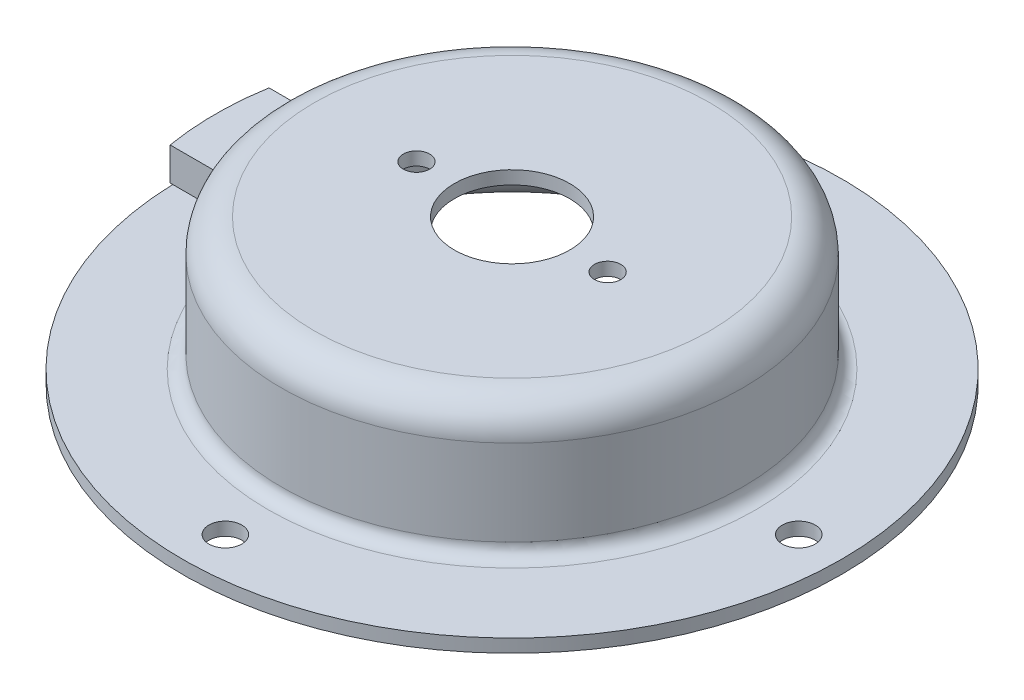
ISO-10303-21;
HEADER;
FILE_DESCRIPTION(('STEP AP214'),'2;1');
FILE_NAME('part.step','',(''),(''),'','','');
FILE_SCHEMA(('AUTOMOTIVE_DESIGN { 1 0 10303 214 1 1 1 1 }'));
ENDSEC;
DATA;
#1=APPLICATION_CONTEXT('core data for automotive mechanical design processes');
#2=APPLICATION_PROTOCOL_DEFINITION('international standard','automotive_design',2000,#1);
#3=PRODUCT_CONTEXT('',#1,'mechanical');
#4=PRODUCT('Part','Part','',(#3));
#5=PRODUCT_RELATED_PRODUCT_CATEGORY('part','',(#4));
#6=PRODUCT_DEFINITION_FORMATION('','',#4);
#7=PRODUCT_DEFINITION_CONTEXT('part definition',#1,'design');
#8=PRODUCT_DEFINITION('design','',#6,#7);
#9=PRODUCT_DEFINITION_SHAPE('','',#8);
#10=(LENGTH_UNIT() NAMED_UNIT(*) SI_UNIT(.MILLI.,.METRE.));
#11=(NAMED_UNIT(*) PLANE_ANGLE_UNIT() SI_UNIT($,.RADIAN.));
#12=(NAMED_UNIT(*) SI_UNIT($,.STERADIAN.) SOLID_ANGLE_UNIT());
#13=UNCERTAINTY_MEASURE_WITH_UNIT(LENGTH_MEASURE(1.E-05),#10,'distance_accuracy_value','');
#14=(GEOMETRIC_REPRESENTATION_CONTEXT(3) GLOBAL_UNCERTAINTY_ASSIGNED_CONTEXT((#13)) GLOBAL_UNIT_ASSIGNED_CONTEXT((#10,
#11,#12)) REPRESENTATION_CONTEXT('',''));
#15=CARTESIAN_POINT('',(0.,0.,0.));
#16=DIRECTION('',(0.,0.,1.));
#17=DIRECTION('',(1.,0.,0.));
#18=AXIS2_PLACEMENT_3D('',#15,#16,#17);
#19=CARTESIAN_POINT('',(-70.001,10.9999999999999,7.5));
#20=DIRECTION('',(0.,1.,0.));
#21=DIRECTION('',(0.,0.,1.));
#22=AXIS2_PLACEMENT_3D('',#19,#20,#21);
#23=PLANE('',#22);
#24=CARTESIAN_POINT('',(0.,10.9999999999999,0.));
#25=DIRECTION('',(0.,1.,0.));
#26=DIRECTION('',(0.,0.,1.));
#27=AXIS2_PLACEMENT_3D('',#24,#25,#26);
#28=CIRCLE('',#27,33.);
#29=CARTESIAN_POINT('',(-32.1364279284429,10.9999999999999,7.5));
#30=VERTEX_POINT('',#29);
#31=CARTESIAN_POINT('',(-32.1364279284428,10.9999999999999,-7.5));
#32=VERTEX_POINT('',#31);
#33=EDGE_CURVE('E134',#30,#32,#28,.F.);
#34=ORIENTED_EDGE('',*,*,#33,.T.);
#35=DIRECTION('',(1.,0.,0.));
#36=VECTOR('',#35,1.);
#37=CARTESIAN_POINT('',(-70.001,10.9999999999999,-7.5));
#38=LINE('',#37,#36);
#39=CARTESIAN_POINT('',(-44.3705983732472,10.9999999999999,-7.5));
#40=VERTEX_POINT('',#39);
#41=EDGE_CURVE('E146',#40,#32,#38,.T.);
#42=ORIENTED_EDGE('',*,*,#41,.F.);
#43=CARTESIAN_POINT('',(0.,10.9999999999999,0.));
#44=DIRECTION('',(0.,1.,0.));
#45=DIRECTION('',(0.,0.,1.));
#46=AXIS2_PLACEMENT_3D('',#43,#44,#45);
#47=CIRCLE('',#46,45.);
#48=CARTESIAN_POINT('',(-44.3705983732472,10.9999999999999,7.5));
#49=VERTEX_POINT('',#48);
#50=EDGE_CURVE('E13',#49,#40,#47,.F.);
#51=ORIENTED_EDGE('',*,*,#50,.F.);
#52=DIRECTION('',(1.,0.,0.));
#53=VECTOR('',#52,1.);
#54=CARTESIAN_POINT('',(-70.001,10.9999999999999,7.5));
#55=LINE('',#54,#53);
#56=EDGE_CURVE('E148',#49,#30,#55,.T.);
#57=ORIENTED_EDGE('',*,*,#56,.T.);
#58=EDGE_LOOP('',(#34,#42,#51,#57));
#59=FACE_BOUND('',#58,.T.);
#60=ADVANCED_FACE('F68',(#59),#23,.T.);
#61=CARTESIAN_POINT('',(-70.001,10.9999999999999,7.5));
#62=DIRECTION('',(0.,0.,1.));
#63=DIRECTION('',(0.,-1.,0.));
#64=AXIS2_PLACEMENT_3D('',#61,#62,#63);
#65=PLANE('',#64);
#66=DIRECTION('',(0.,-1.,0.));
#67=VECTOR('',#66,1.);
#68=CARTESIAN_POINT('',(-32.1364279284429,20.001,7.49999999999989));
#69=LINE('',#68,#67);
#70=CARTESIAN_POINT('',(-32.1364279284429,5.9999999999999,7.49999999999989));
#71=VERTEX_POINT('',#70);
#72=EDGE_CURVE('E140',#30,#71,#69,.T.);
#73=ORIENTED_EDGE('',*,*,#72,.F.);
#74=ORIENTED_EDGE('',*,*,#56,.F.);
#75=DIRECTION('',(0.,-1.,0.));
#76=VECTOR('',#75,1.);
#77=CARTESIAN_POINT('',(-44.3705983732441,-881.361015130249,7.49999999999985));
#78=LINE('',#77,#76);
#79=CARTESIAN_POINT('',(-44.3705983732472,5.99999999999989,7.49999999999985));
#80=VERTEX_POINT('',#79);
#81=EDGE_CURVE('E176',#80,#49,#78,.F.);
#82=ORIENTED_EDGE('',*,*,#81,.F.);
#83=DIRECTION('',(1.,0.,0.));
#84=VECTOR('',#83,1.);
#85=CARTESIAN_POINT('',(-70.001,5.9999999999999,7.5));
#86=LINE('',#85,#84);
#87=EDGE_CURVE('E154',#80,#71,#86,.T.);
#88=ORIENTED_EDGE('',*,*,#87,.T.);
#89=EDGE_LOOP('',(#73,#74,#82,#88));
#90=FACE_BOUND('',#89,.T.);
#91=ADVANCED_FACE('F219',(#90),#65,.T.);
#92=CARTESIAN_POINT('',(-70.001,5.9999999999999,7.5));
#93=DIRECTION('',(0.,-1.,0.));
#94=DIRECTION('',(0.,0.,-1.));
#95=AXIS2_PLACEMENT_3D('',#92,#93,#94);
#96=PLANE('',#95);
#97=CARTESIAN_POINT('',(0.,5.9999999999999,0.));
#98=DIRECTION('',(0.,-1.,0.));
#99=DIRECTION('',(0.,0.,-1.));
#100=AXIS2_PLACEMENT_3D('',#97,#98,#99);
#101=CIRCLE('',#100,33.);
#102=CARTESIAN_POINT('',(-32.1364279284428,5.9999999999999,-7.5));
#103=VERTEX_POINT('',#102);
#104=EDGE_CURVE('E85',#71,#103,#101,.T.);
#105=ORIENTED_EDGE('',*,*,#104,.F.);
#106=ORIENTED_EDGE('',*,*,#87,.F.);
#107=CARTESIAN_POINT('',(0.,5.99999999999989,0.));
#108=DIRECTION('',(0.,-1.,0.));
#109=DIRECTION('',(0.,0.,-1.));
#110=AXIS2_PLACEMENT_3D('',#107,#108,#109);
#111=CIRCLE('',#110,45.);
#112=CARTESIAN_POINT('',(-44.3705983732472,5.99999999999989,-7.5));
#113=VERTEX_POINT('',#112);
#114=EDGE_CURVE('E174',#113,#80,#111,.F.);
#115=ORIENTED_EDGE('',*,*,#114,.F.);
#116=DIRECTION('',(1.,0.,0.));
#117=VECTOR('',#116,1.);
#118=CARTESIAN_POINT('',(-70.001,5.9999999999999,-7.5));
#119=LINE('',#118,#117);
#120=EDGE_CURVE('E162',#113,#103,#119,.T.);
#121=ORIENTED_EDGE('',*,*,#120,.T.);
#122=EDGE_LOOP('',(#105,#106,#115,#121));
#123=FACE_BOUND('',#122,.T.);
#124=ADVANCED_FACE('F216',(#123),#96,.T.);
#125=CARTESIAN_POINT('',(-70.001,10.9999999999999,-7.5));
#126=DIRECTION('',(0.,0.,-1.));
#127=DIRECTION('',(-1.,0.,0.));
#128=AXIS2_PLACEMENT_3D('',#125,#126,#127);
#129=PLANE('',#128);
#130=DIRECTION('',(0.,-1.,0.));
#131=VECTOR('',#130,1.);
#132=CARTESIAN_POINT('',(-32.1364279284428,20.001,-7.5));
#133=LINE('',#132,#131);
#134=EDGE_CURVE('E131',#32,#103,#133,.T.);
#135=ORIENTED_EDGE('',*,*,#134,.T.);
#136=ORIENTED_EDGE('',*,*,#120,.F.);
#137=DIRECTION('',(0.,-1.,0.));
#138=VECTOR('',#137,1.);
#139=CARTESIAN_POINT('',(-44.3705983732441,-881.361015130249,-7.5));
#140=LINE('',#139,#138);
#141=EDGE_CURVE('E152',#40,#113,#140,.T.);
#142=ORIENTED_EDGE('',*,*,#141,.F.);
#143=ORIENTED_EDGE('',*,*,#41,.T.);
#144=EDGE_LOOP('',(#135,#136,#142,#143));
#145=FACE_BOUND('',#144,.T.);
#146=ADVANCED_FACE('F70',(#145),#129,.T.);
#147=CARTESIAN_POINT('',(-70.001,9.9999999999999,7.5));
#148=DIRECTION('',(0.,1.,0.));
#149=DIRECTION('',(0.,0.,1.));
#150=AXIS2_PLACEMENT_3D('',#147,#148,#149);
#151=PLANE('',#150);
#152=DIRECTION('',(1.,0.,0.));
#153=VECTOR('',#152,1.);
#154=CARTESIAN_POINT('',(-70.001,9.9999999999999,-6.5));
#155=LINE('',#154,#153);
#156=CARTESIAN_POINT('',(-44.5280810275943,9.9999999999999,-6.5));
#157=VERTEX_POINT('',#156);
#158=CARTESIAN_POINT('',(-32.3535160376736,9.9999999999999,-6.5));
#159=VERTEX_POINT('',#158);
#160=EDGE_CURVE('E164',#157,#159,#155,.T.);
#161=ORIENTED_EDGE('',*,*,#160,.T.);
#162=CARTESIAN_POINT('',(0.,9.9999999999999,0.));
#163=DIRECTION('',(0.,1.,0.));
#164=DIRECTION('',(0.,0.,1.));
#165=AXIS2_PLACEMENT_3D('',#162,#163,#164);
#166=CIRCLE('',#165,33.);
#167=CARTESIAN_POINT('',(-32.3535160376736,9.9999999999999,6.5));
#168=VERTEX_POINT('',#167);
#169=EDGE_CURVE('E93',#168,#159,#166,.F.);
#170=ORIENTED_EDGE('',*,*,#169,.F.);
#171=DIRECTION('',(1.,0.,0.));
#172=VECTOR('',#171,1.);
#173=CARTESIAN_POINT('',(-70.001,9.9999999999999,6.5));
#174=LINE('',#173,#172);
#175=CARTESIAN_POINT('',(-44.5280810275943,9.9999999999999,6.5));
#176=VERTEX_POINT('',#175);
#177=EDGE_CURVE('E167',#176,#168,#174,.T.);
#178=ORIENTED_EDGE('',*,*,#177,.F.);
#179=CARTESIAN_POINT('',(0.,9.9999999999999,0.));
#180=DIRECTION('',(0.,1.,0.));
#181=DIRECTION('',(0.,0.,1.));
#182=AXIS2_PLACEMENT_3D('',#179,#180,#181);
#183=CIRCLE('',#182,45.);
#184=EDGE_CURVE('E72',#176,#157,#183,.F.);
#185=ORIENTED_EDGE('',*,*,#184,.T.);
#186=EDGE_LOOP('',(#161,#170,#178,#185));
#187=FACE_BOUND('',#186,.T.);
#188=ADVANCED_FACE('F208',(#187),#151,.F.);
#189=CARTESIAN_POINT('',(-70.001,10.9999999999999,6.5));
#190=DIRECTION('',(0.,0.,1.));
#191=DIRECTION('',(0.,-1.,0.));
#192=AXIS2_PLACEMENT_3D('',#189,#190,#191);
#193=PLANE('',#192);
#194=ORIENTED_EDGE('',*,*,#177,.T.);
#195=DIRECTION('',(0.,-1.,0.));
#196=VECTOR('',#195,1.);
#197=CARTESIAN_POINT('',(-32.3535160376736,20.001,6.5));
#198=LINE('',#197,#196);
#199=CARTESIAN_POINT('',(-32.3535160376736,6.9999999999999,6.5));
#200=VERTEX_POINT('',#199);
#201=EDGE_CURVE('E188',#200,#168,#198,.F.);
#202=ORIENTED_EDGE('',*,*,#201,.F.);
#203=DIRECTION('',(1.,0.,0.));
#204=VECTOR('',#203,1.);
#205=CARTESIAN_POINT('',(-70.001,6.9999999999999,6.5));
#206=LINE('',#205,#204);
#207=CARTESIAN_POINT('',(-44.5280810275944,6.9999999999999,6.49999999999985));
#208=VERTEX_POINT('',#207);
#209=EDGE_CURVE('E157',#208,#200,#206,.T.);
#210=ORIENTED_EDGE('',*,*,#209,.F.);
#211=DIRECTION('',(0.,-1.,0.));
#212=VECTOR('',#211,1.);
#213=CARTESIAN_POINT('',(-44.5280810275913,-881.361015130249,6.49999999999985));
#214=LINE('',#213,#212);
#215=EDGE_CURVE('E77',#208,#176,#214,.F.);
#216=ORIENTED_EDGE('',*,*,#215,.T.);
#217=EDGE_LOOP('',(#194,#202,#210,#216));
#218=FACE_BOUND('',#217,.T.);
#219=ADVANCED_FACE('F206',(#218),#193,.F.);
#220=CARTESIAN_POINT('',(-70.001,6.9999999999999,7.5));
#221=DIRECTION('',(0.,-1.,0.));
#222=DIRECTION('',(0.,0.,-1.));
#223=AXIS2_PLACEMENT_3D('',#220,#221,#222);
#224=PLANE('',#223);
#225=ORIENTED_EDGE('',*,*,#209,.T.);
#226=CARTESIAN_POINT('',(0.,6.9999999999999,0.));
#227=DIRECTION('',(0.,-1.,0.));
#228=DIRECTION('',(0.,0.,-1.));
#229=AXIS2_PLACEMENT_3D('',#226,#227,#228);
#230=CIRCLE('',#229,33.);
#231=CARTESIAN_POINT('',(-32.3535160376736,6.9999999999999,-6.5));
#232=VERTEX_POINT('',#231);
#233=EDGE_CURVE('E190',#232,#200,#230,.F.);
#234=ORIENTED_EDGE('',*,*,#233,.F.);
#235=DIRECTION('',(1.,0.,0.));
#236=VECTOR('',#235,1.);
#237=CARTESIAN_POINT('',(-70.001,6.9999999999999,-6.5));
#238=LINE('',#237,#236);
#239=CARTESIAN_POINT('',(-44.5280810275943,6.9999999999999,-6.5));
#240=VERTEX_POINT('',#239);
#241=EDGE_CURVE('E153',#240,#232,#238,.T.);
#242=ORIENTED_EDGE('',*,*,#241,.F.);
#243=CARTESIAN_POINT('',(0.,6.9999999999999,0.));
#244=DIRECTION('',(0.,-1.,0.));
#245=DIRECTION('',(0.,0.,-1.));
#246=AXIS2_PLACEMENT_3D('',#243,#244,#245);
#247=CIRCLE('',#246,45.);
#248=EDGE_CURVE('E180',#240,#208,#247,.F.);
#249=ORIENTED_EDGE('',*,*,#248,.T.);
#250=EDGE_LOOP('',(#225,#234,#242,#249));
#251=FACE_BOUND('',#250,.T.);
#252=ADVANCED_FACE('F198',(#251),#224,.F.);
#253=CARTESIAN_POINT('',(-70.001,10.9999999999999,-6.5));
#254=DIRECTION('',(0.,0.,-1.));
#255=DIRECTION('',(-1.,0.,0.));
#256=AXIS2_PLACEMENT_3D('',#253,#254,#255);
#257=PLANE('',#256);
#258=ORIENTED_EDGE('',*,*,#241,.T.);
#259=DIRECTION('',(0.,-1.,0.));
#260=VECTOR('',#259,1.);
#261=CARTESIAN_POINT('',(-32.3535160376736,20.001,-6.5));
#262=LINE('',#261,#260);
#263=EDGE_CURVE('E149',#159,#232,#262,.T.);
#264=ORIENTED_EDGE('',*,*,#263,.F.);
#265=ORIENTED_EDGE('',*,*,#160,.F.);
#266=DIRECTION('',(0.,-1.,0.));
#267=VECTOR('',#266,1.);
#268=CARTESIAN_POINT('',(-44.5280810275912,-881.361015130249,-6.5));
#269=LINE('',#268,#267);
#270=EDGE_CURVE('E173',#157,#240,#269,.T.);
#271=ORIENTED_EDGE('',*,*,#270,.T.);
#272=EDGE_LOOP('',(#258,#264,#265,#271));
#273=FACE_BOUND('',#272,.T.);
#274=ADVANCED_FACE('F200',(#273),#257,.F.);
#275=CARTESIAN_POINT('',(3.0772555371111E-12,-881.361015130248,0.));
#276=DIRECTION('',(0.,-1.,0.));
#277=DIRECTION('',(1.,0.,0.));
#278=AXIS2_PLACEMENT_3D('',#275,#276,#277);
#279=CYLINDRICAL_SURFACE('',#278,45.);
#280=ORIENTED_EDGE('',*,*,#141,.T.);
#281=ORIENTED_EDGE('',*,*,#114,.T.);
#282=ORIENTED_EDGE('',*,*,#81,.T.);
#283=ORIENTED_EDGE('',*,*,#50,.T.);
#284=EDGE_LOOP('',(#280,#281,#282,#283));
#285=FACE_BOUND('',#284,.T.);
#286=ORIENTED_EDGE('',*,*,#184,.F.);
#287=ORIENTED_EDGE('',*,*,#215,.F.);
#288=ORIENTED_EDGE('',*,*,#248,.F.);
#289=ORIENTED_EDGE('',*,*,#270,.F.);
#290=EDGE_LOOP('',(#286,#287,#288,#289));
#291=FACE_BOUND('',#290,.T.);
#292=ADVANCED_FACE('F203',(#285,#291),#279,.T.);
#293=CARTESIAN_POINT('',(0.,20.001,0.));
#294=DIRECTION('',(0.,-1.,0.));
#295=DIRECTION('',(0.,0.,-1.));
#296=AXIS2_PLACEMENT_3D('',#293,#294,#295);
#297=CYLINDRICAL_SURFACE('',#296,33.);
#298=ORIENTED_EDGE('',*,*,#72,.T.);
#299=ORIENTED_EDGE('',*,*,#104,.T.);
#300=ORIENTED_EDGE('',*,*,#134,.F.);
#301=ORIENTED_EDGE('',*,*,#33,.F.);
#302=EDGE_LOOP('',(#298,#299,#300,#301));
#303=FACE_BOUND('',#302,.T.);
#304=ORIENTED_EDGE('',*,*,#169,.T.);
#305=ORIENTED_EDGE('',*,*,#263,.T.);
#306=ORIENTED_EDGE('',*,*,#233,.T.);
#307=ORIENTED_EDGE('',*,*,#201,.T.);
#308=EDGE_LOOP('',(#304,#305,#306,#307));
#309=FACE_BOUND('',#308,.T.);
#310=ADVANCED_FACE('F133',(#303,#309),#297,.F.);
#311=CLOSED_SHELL('',(#60,#91,#124,#146,#188,#219,#252,#274,#292,#310));
#312=MANIFOLD_SOLID_BREP('B2',#311);
#313=CARTESIAN_POINT('',(37.,-2.00000000000002,0.));
#314=DIRECTION('',(0.,-1.,0.));
#315=DIRECTION('',(1.,0.,0.));
#316=AXIS2_PLACEMENT_3D('',#313,#314,#315);
#317=PLANE('',#316);
#318=CARTESIAN_POINT('',(0.,-2.00000000000022,-43.5));
#319=DIRECTION('',(0.,1.,0.));
#320=DIRECTION('',(-1.,0.,0.));
#321=AXIS2_PLACEMENT_3D('',#318,#319,#320);
#322=CIRCLE('',#321,2.5);
#323=CARTESIAN_POINT('',(-2.49999999999999,-2.00000000000023,-43.5));
#324=VERTEX_POINT('',#323);
#325=EDGE_CURVE('E357',#324,#324,#322,.T.);
#326=ORIENTED_EDGE('',*,*,#325,.T.);
#327=EDGE_LOOP('',(#326));
#328=FACE_BOUND('',#327,.T.);
#329=CARTESIAN_POINT('',(43.5000000000017,-2.00000000000007,-1.69464628172975E-12));
#330=DIRECTION('',(0.,1.,0.));
#331=DIRECTION('',(-1.,0.,0.));
#332=AXIS2_PLACEMENT_3D('',#329,#330,#331);
#333=CIRCLE('',#332,2.50000000000127);
#334=CARTESIAN_POINT('',(41.0000000000004,-2.00000000000008,-1.69464628172975E-12));
#335=VERTEX_POINT('',#334);
#336=EDGE_CURVE('E477',#335,#335,#333,.T.);
#337=ORIENTED_EDGE('',*,*,#336,.T.);
#338=EDGE_LOOP('',(#337));
#339=FACE_BOUND('',#338,.T.);
#340=CARTESIAN_POINT('',(3.39627552613718E-12,-2.00000000000022,43.5));
#341=DIRECTION('',(0.,1.,0.));
#342=DIRECTION('',(-1.,0.,0.));
#343=AXIS2_PLACEMENT_3D('',#340,#341,#342);
#344=CIRCLE('',#343,2.50000000000353);
#345=CARTESIAN_POINT('',(-2.50000000000014,-2.00000000000023,43.5));
#346=VERTEX_POINT('',#345);
#347=EDGE_CURVE('E481',#346,#346,#344,.T.);
#348=ORIENTED_EDGE('',*,*,#347,.T.);
#349=EDGE_LOOP('',(#348));
#350=FACE_BOUND('',#349,.T.);
#351=CARTESIAN_POINT('',(-43.4999999999983,-2.00000000000038,1.69997349530604E-12));
#352=DIRECTION('',(0.,1.,0.));
#353=DIRECTION('',(-1.,0.,0.));
#354=AXIS2_PLACEMENT_3D('',#351,#352,#353);
#355=CIRCLE('',#354,2.50000000000256);
#356=CARTESIAN_POINT('',(-46.0000000000009,-2.00000000000038,1.69997349530604E-12));
#357=VERTEX_POINT('',#356);
#358=EDGE_CURVE('E485',#357,#357,#355,.T.);
#359=ORIENTED_EDGE('',*,*,#358,.T.);
#360=EDGE_LOOP('',(#359));
#361=FACE_BOUND('',#360,.T.);
#362=CARTESIAN_POINT('',(0.,-2.00000000000022,0.));
#363=DIRECTION('',(0.,-1.,0.));
#364=DIRECTION('',(1.,0.,0.));
#365=AXIS2_PLACEMENT_3D('',#362,#363,#364);
#366=CIRCLE('',#365,50.);
#367=CARTESIAN_POINT('',(50.,-2.00000000000005,0.));
#368=VERTEX_POINT('',#367);
#369=EDGE_CURVE('E66',#368,#368,#366,.T.);
#370=ORIENTED_EDGE('',*,*,#369,.T.);
#371=EDGE_LOOP('',(#370));
#372=FACE_BOUND('',#371,.T.);
#373=CARTESIAN_POINT('',(0.,-2.00000000000011,0.));
#374=DIRECTION('',(0.,-1.,0.));
#375=DIRECTION('',(1.,0.,0.));
#376=AXIS2_PLACEMENT_3D('',#373,#374,#375);
#377=CIRCLE('',#376,37.);
#378=CARTESIAN_POINT('',(37.,-1.99999999999998,0.));
#379=VERTEX_POINT('',#378);
#380=EDGE_CURVE('E385',#379,#379,#377,.T.);
#381=ORIENTED_EDGE('',*,*,#380,.F.);
#382=EDGE_LOOP('',(#381));
#383=FACE_BOUND('',#382,.T.);
#384=ADVANCED_FACE('F299',(#328,#339,#350,#361,#372,#383),#317,.T.);
#385=CARTESIAN_POINT('',(3.0772555371111E-12,-881.361015130248,0.));
#386=DIRECTION('',(0.,-1.,0.));
#387=DIRECTION('',(1.,0.,0.));
#388=AXIS2_PLACEMENT_3D('',#385,#386,#387);
#389=CYLINDRICAL_SURFACE('',#388,50.);
#390=ORIENTED_EDGE('',*,*,#369,.F.);
#391=EDGE_LOOP('',(#390));
#392=FACE_BOUND('',#391,.T.);
#393=CARTESIAN_POINT('',(0.,-2.22044604925031E-13,0.));
#394=DIRECTION('',(0.,-1.,0.));
#395=DIRECTION('',(1.,0.,0.));
#396=AXIS2_PLACEMENT_3D('',#393,#394,#395);
#397=CIRCLE('',#396,50.);
#398=CARTESIAN_POINT('',(50.,0.,0.));
#399=VERTEX_POINT('',#398);
#400=EDGE_CURVE('E306',#399,#399,#397,.T.);
#401=ORIENTED_EDGE('',*,*,#400,.T.);
#402=EDGE_LOOP('',(#401));
#403=FACE_BOUND('',#402,.T.);
#404=ADVANCED_FACE('F425',(#392,#403),#389,.T.);
#405=CARTESIAN_POINT('',(37.,0.,0.));
#406=DIRECTION('',(0.,-1.,0.));
#407=DIRECTION('',(1.,0.,0.));
#408=AXIS2_PLACEMENT_3D('',#405,#406,#407);
#409=PLANE('',#408);
#410=CARTESIAN_POINT('',(0.,0.,-43.5));
#411=DIRECTION('',(0.,1.,0.));
#412=DIRECTION('',(-1.,0.,0.));
#413=AXIS2_PLACEMENT_3D('',#410,#411,#412);
#414=CIRCLE('',#413,2.5);
#415=CARTESIAN_POINT('',(-2.5,0.,-43.5));
#416=VERTEX_POINT('',#415);
#417=EDGE_CURVE('E362',#416,#416,#414,.T.);
#418=ORIENTED_EDGE('',*,*,#417,.F.);
#419=EDGE_LOOP('',(#418));
#420=FACE_BOUND('',#419,.T.);
#421=CARTESIAN_POINT('',(43.5000000000017,1.51879438239682E-13,-1.69464628172975E-12));
#422=DIRECTION('',(0.,1.,0.));
#423=DIRECTION('',(-1.,0.,0.));
#424=AXIS2_PLACEMENT_3D('',#421,#422,#423);
#425=CIRCLE('',#424,2.50000000000127);
#426=CARTESIAN_POINT('',(41.0000000000004,1.4315073489257E-13,-1.69464628172975E-12));
#427=VERTEX_POINT('',#426);
#428=EDGE_CURVE('E553',#427,#427,#425,.T.);
#429=ORIENTED_EDGE('',*,*,#428,.F.);
#430=EDGE_LOOP('',(#429));
#431=FACE_BOUND('',#430,.T.);
#432=CARTESIAN_POINT('',(3.3892925634595E-12,0.,43.5));
#433=DIRECTION('',(0.,1.,0.));
#434=DIRECTION('',(-1.,0.,0.));
#435=AXIS2_PLACEMENT_3D('',#432,#433,#434);
#436=CIRCLE('',#435,2.50000000000353);
#437=CARTESIAN_POINT('',(-2.50000000000014,0.,43.5));
#438=VERTEX_POINT('',#437);
#439=EDGE_CURVE('E559',#438,#438,#436,.T.);
#440=ORIENTED_EDGE('',*,*,#439,.F.);
#441=EDGE_LOOP('',(#440));
#442=FACE_BOUND('',#441,.T.);
#443=CARTESIAN_POINT('',(-43.4999999999983,-1.5187943823967E-13,1.69997349530604E-12));
#444=DIRECTION('',(0.,1.,0.));
#445=DIRECTION('',(-1.,0.,0.));
#446=AXIS2_PLACEMENT_3D('',#443,#444,#445);
#447=CIRCLE('',#446,2.50000000000256);
#448=CARTESIAN_POINT('',(-46.0000000000009,-1.60608141586787E-13,1.69997349530604E-12));
#449=VERTEX_POINT('',#448);
#450=EDGE_CURVE('E365',#449,#449,#447,.T.);
#451=ORIENTED_EDGE('',*,*,#450,.F.);
#452=EDGE_LOOP('',(#451));
#453=FACE_BOUND('',#452,.T.);
#454=ORIENTED_EDGE('',*,*,#400,.F.);
#455=EDGE_LOOP('',(#454));
#456=FACE_BOUND('',#455,.T.);
#457=CARTESIAN_POINT('',(0.,-1.11022302462516E-13,0.));
#458=DIRECTION('',(0.,-1.,0.));
#459=DIRECTION('',(1.,0.,0.));
#460=AXIS2_PLACEMENT_3D('',#457,#458,#459);
#461=CIRCLE('',#460,37.);
#462=CARTESIAN_POINT('',(37.,0.,0.));
#463=VERTEX_POINT('',#462);
#464=EDGE_CURVE('E420',#463,#463,#461,.T.);
#465=ORIENTED_EDGE('',*,*,#464,.T.);
#466=EDGE_LOOP('',(#465));
#467=FACE_BOUND('',#466,.T.);
#468=ADVANCED_FACE('F427',(#420,#431,#442,#453,#456,#467),#409,.F.);
#469=CARTESIAN_POINT('',(0.,1.99999999999989,0.));
#470=DIRECTION('',(0.,-1.,0.));
#471=DIRECTION('',(1.,0.,0.));
#472=AXIS2_PLACEMENT_3D('',#469,#470,#471);
#473=TOROIDAL_SURFACE('',#472,37.,2.);
#474=ORIENTED_EDGE('',*,*,#464,.F.);
#475=EDGE_LOOP('',(#474));
#476=FACE_BOUND('',#475,.T.);
#477=CARTESIAN_POINT('',(0.,1.99999999999989,0.));
#478=DIRECTION('',(0.,-1.,0.));
#479=DIRECTION('',(1.,0.,0.));
#480=AXIS2_PLACEMENT_3D('',#477,#478,#479);
#481=CIRCLE('',#480,35.);
#482=CARTESIAN_POINT('',(35.,2.00000000000001,0.));
#483=VERTEX_POINT('',#482);
#484=EDGE_CURVE('E417',#483,#483,#481,.T.);
#485=ORIENTED_EDGE('',*,*,#484,.T.);
#486=EDGE_LOOP('',(#485));
#487=FACE_BOUND('',#486,.T.);
#488=ADVANCED_FACE('F430',(#476,#487),#473,.F.);
#489=CARTESIAN_POINT('',(3.0772555371111E-12,-881.361015130248,0.));
#490=DIRECTION('',(0.,-1.,0.));
#491=DIRECTION('',(1.,0.,0.));
#492=AXIS2_PLACEMENT_3D('',#489,#490,#491);
#493=CYLINDRICAL_SURFACE('',#492,35.);
#494=CARTESIAN_POINT('',(0.,5.99999999999989,0.));
#495=DIRECTION('',(0.,-1.,0.));
#496=DIRECTION('',(0.,0.,-1.));
#497=AXIS2_PLACEMENT_3D('',#494,#495,#496);
#498=CIRCLE('',#497,35.);
#499=CARTESIAN_POINT('',(-34.1869858279434,5.99999999999989,-7.5));
#500=VERTEX_POINT('',#499);
#501=CARTESIAN_POINT('',(-34.1869858279435,5.9999999999999,7.5));
#502=VERTEX_POINT('',#501);
#503=EDGE_CURVE('E370',#500,#502,#498,.F.);
#504=ORIENTED_EDGE('',*,*,#503,.F.);
#505=DIRECTION('',(0.,-1.,0.));
#506=VECTOR('',#505,1.);
#507=CARTESIAN_POINT('',(-34.1869858279403,-881.361015130249,-7.5));
#508=LINE('',#507,#506);
#509=CARTESIAN_POINT('',(-34.1869858279434,10.9999999999999,-7.5));
#510=VERTEX_POINT('',#509);
#511=EDGE_CURVE('E373',#510,#500,#508,.T.);
#512=ORIENTED_EDGE('',*,*,#511,.F.);
#513=CARTESIAN_POINT('',(0.,10.9999999999999,0.));
#514=DIRECTION('',(0.,1.,0.));
#515=DIRECTION('',(0.,0.,1.));
#516=AXIS2_PLACEMENT_3D('',#513,#514,#515);
#517=CIRCLE('',#516,35.);
#518=CARTESIAN_POINT('',(-34.1869858279434,10.9999999999999,7.5));
#519=VERTEX_POINT('',#518);
#520=EDGE_CURVE('E345',#519,#510,#517,.F.);
#521=ORIENTED_EDGE('',*,*,#520,.F.);
#522=DIRECTION('',(0.,-1.,0.));
#523=VECTOR('',#522,1.);
#524=CARTESIAN_POINT('',(-34.1869858279404,-881.361015130249,7.49999999999985));
#525=LINE('',#524,#523);
#526=EDGE_CURVE('E313',#502,#519,#525,.F.);
#527=ORIENTED_EDGE('',*,*,#526,.F.);
#528=EDGE_LOOP('',(#504,#512,#521,#527));
#529=FACE_BOUND('',#528,.T.);
#530=ORIENTED_EDGE('',*,*,#484,.F.);
#531=EDGE_LOOP('',(#530));
#532=FACE_BOUND('',#531,.T.);
#533=CARTESIAN_POINT('',(0.,14.9999999999999,0.));
#534=DIRECTION('',(0.,-1.,0.));
#535=DIRECTION('',(1.,0.,0.));
#536=AXIS2_PLACEMENT_3D('',#533,#534,#535);
#537=CIRCLE('',#536,35.0000000000001);
#538=CARTESIAN_POINT('',(35.,15.,0.));
#539=VERTEX_POINT('',#538);
#540=EDGE_CURVE('E414',#539,#539,#537,.T.);
#541=ORIENTED_EDGE('',*,*,#540,.T.);
#542=EDGE_LOOP('',(#541));
#543=FACE_BOUND('',#542,.T.);
#544=ADVANCED_FACE('F437',(#529,#532,#543),#493,.T.);
#545=CARTESIAN_POINT('',(0.,14.9999999999999,0.));
#546=DIRECTION('',(0.,-1.,0.));
#547=DIRECTION('',(1.,0.,0.));
#548=AXIS2_PLACEMENT_3D('',#545,#546,#547);
#549=TOROIDAL_SURFACE('',#548,30.0000000000001,5.00000000000001);
#550=ORIENTED_EDGE('',*,*,#540,.F.);
#551=EDGE_LOOP('',(#550));
#552=FACE_BOUND('',#551,.T.);
#553=CARTESIAN_POINT('',(0.,19.9999999999999,0.));
#554=DIRECTION('',(0.,-1.,0.));
#555=DIRECTION('',(1.,0.,0.));
#556=AXIS2_PLACEMENT_3D('',#553,#554,#555);
#557=CIRCLE('',#556,30.0000000000001);
#558=CARTESIAN_POINT('',(30.,20.,0.));
#559=VERTEX_POINT('',#558);
#560=EDGE_CURVE('E411',#559,#559,#557,.T.);
#561=ORIENTED_EDGE('',*,*,#560,.T.);
#562=EDGE_LOOP('',(#561));
#563=FACE_BOUND('',#562,.T.);
#564=ADVANCED_FACE('F443',(#552,#563),#549,.T.);
#565=CARTESIAN_POINT('',(0.,20.,0.));
#566=DIRECTION('',(0.,-1.,0.));
#567=DIRECTION('',(1.,0.,0.));
#568=AXIS2_PLACEMENT_3D('',#565,#566,#567);
#569=PLANE('',#568);
#570=CARTESIAN_POINT('',(14.4999999999999,20.,0.));
#571=DIRECTION('',(0.,1.,0.));
#572=DIRECTION('',(-1.,0.,0.));
#573=AXIS2_PLACEMENT_3D('',#570,#571,#572);
#574=CIRCLE('',#573,2.);
#575=CARTESIAN_POINT('',(12.4999999999999,20.,0.));
#576=VERTEX_POINT('',#575);
#577=EDGE_CURVE('E382',#576,#576,#574,.T.);
#578=ORIENTED_EDGE('',*,*,#577,.F.);
#579=EDGE_LOOP('',(#578));
#580=FACE_BOUND('',#579,.T.);
#581=CARTESIAN_POINT('',(-14.5000000000001,19.9999999999999,0.));
#582=DIRECTION('',(0.,1.,0.));
#583=DIRECTION('',(-1.,0.,0.));
#584=AXIS2_PLACEMENT_3D('',#581,#582,#583);
#585=CIRCLE('',#584,2.);
#586=CARTESIAN_POINT('',(-16.5000000000001,19.9999999999999,0.));
#587=VERTEX_POINT('',#586);
#588=EDGE_CURVE('E389',#587,#587,#585,.T.);
#589=ORIENTED_EDGE('',*,*,#588,.F.);
#590=EDGE_LOOP('',(#589));
#591=FACE_BOUND('',#590,.T.);
#592=CARTESIAN_POINT('',(0.,20.,0.));
#593=DIRECTION('',(0.,1.,0.));
#594=DIRECTION('',(-1.,0.,0.));
#595=AXIS2_PLACEMENT_3D('',#592,#593,#594);
#596=CIRCLE('',#595,8.75);
#597=CARTESIAN_POINT('',(-8.75000000000007,19.9999999999999,0.));
#598=VERTEX_POINT('',#597);
#599=EDGE_CURVE('E395',#598,#598,#596,.T.);
#600=ORIENTED_EDGE('',*,*,#599,.F.);
#601=EDGE_LOOP('',(#600));
#602=FACE_BOUND('',#601,.T.);
#603=ORIENTED_EDGE('',*,*,#560,.F.);
#604=EDGE_LOOP('',(#603));
#605=FACE_BOUND('',#604,.T.);
#606=ADVANCED_FACE('F450',(#580,#591,#602,#605),#569,.F.);
#607=CARTESIAN_POINT('',(0.,18.,0.));
#608=DIRECTION('',(0.,-1.,0.));
#609=DIRECTION('',(1.,0.,0.));
#610=AXIS2_PLACEMENT_3D('',#607,#608,#609);
#611=PLANE('',#610);
#612=CARTESIAN_POINT('',(14.4999999999999,18.,0.));
#613=DIRECTION('',(0.,-1.,0.));
#614=DIRECTION('',(1.,0.,0.));
#615=AXIS2_PLACEMENT_3D('',#612,#613,#614);
#616=CIRCLE('',#615,2.);
#617=CARTESIAN_POINT('',(16.4999999999999,18.,0.));
#618=VERTEX_POINT('',#617);
#619=EDGE_CURVE('E386',#618,#618,#616,.F.);
#620=ORIENTED_EDGE('',*,*,#619,.T.);
#621=EDGE_LOOP('',(#620));
#622=FACE_BOUND('',#621,.T.);
#623=CARTESIAN_POINT('',(-14.5000000000001,17.9999999999999,0.));
#624=DIRECTION('',(0.,-1.,0.));
#625=DIRECTION('',(1.,0.,0.));
#626=AXIS2_PLACEMENT_3D('',#623,#624,#625);
#627=CIRCLE('',#626,2.);
#628=CARTESIAN_POINT('',(-12.5000000000001,17.9999999999999,0.));
#629=VERTEX_POINT('',#628);
#630=EDGE_CURVE('E392',#629,#629,#627,.F.);
#631=ORIENTED_EDGE('',*,*,#630,.T.);
#632=EDGE_LOOP('',(#631));
#633=FACE_BOUND('',#632,.T.);
#634=CARTESIAN_POINT('',(0.,18.,0.));
#635=DIRECTION('',(0.,-1.,0.));
#636=DIRECTION('',(1.,0.,0.));
#637=AXIS2_PLACEMENT_3D('',#634,#635,#636);
#638=CIRCLE('',#637,8.75);
#639=CARTESIAN_POINT('',(8.74999999999994,18.,0.));
#640=VERTEX_POINT('',#639);
#641=EDGE_CURVE('E381',#640,#640,#638,.F.);
#642=ORIENTED_EDGE('',*,*,#641,.T.);
#643=EDGE_LOOP('',(#642));
#644=FACE_BOUND('',#643,.T.);
#645=CARTESIAN_POINT('',(0.,17.9999999999999,0.));
#646=DIRECTION('',(0.,-1.,0.));
#647=DIRECTION('',(1.,0.,0.));
#648=AXIS2_PLACEMENT_3D('',#645,#646,#647);
#649=CIRCLE('',#648,30.0000000000001);
#650=CARTESIAN_POINT('',(30.,18.,0.));
#651=VERTEX_POINT('',#650);
#652=EDGE_CURVE('E408',#651,#651,#649,.T.);
#653=ORIENTED_EDGE('',*,*,#652,.T.);
#654=EDGE_LOOP('',(#653));
#655=FACE_BOUND('',#654,.T.);
#656=ADVANCED_FACE('F455',(#622,#633,#644,#655),#611,.T.);
#657=CARTESIAN_POINT('',(0.,14.9999999999999,0.));
#658=DIRECTION('',(0.,-1.,0.));
#659=DIRECTION('',(1.,0.,0.));
#660=AXIS2_PLACEMENT_3D('',#657,#658,#659);
#661=TOROIDAL_SURFACE('',#660,30.0000000000001,3.00000000000001);
#662=CARTESIAN_POINT('',(0.,14.9999999999999,0.));
#663=DIRECTION('',(0.,-1.,0.));
#664=DIRECTION('',(1.,0.,0.));
#665=AXIS2_PLACEMENT_3D('',#662,#663,#664);
#666=CIRCLE('',#665,33.0000000000001);
#667=CARTESIAN_POINT('',(33.,15.,0.));
#668=VERTEX_POINT('',#667);
#669=EDGE_CURVE('E405',#668,#668,#666,.T.);
#670=ORIENTED_EDGE('',*,*,#669,.T.);
#671=EDGE_LOOP('',(#670));
#672=FACE_BOUND('',#671,.T.);
#673=ORIENTED_EDGE('',*,*,#652,.F.);
#674=EDGE_LOOP('',(#673));
#675=FACE_BOUND('',#674,.T.);
#676=ADVANCED_FACE('F461',(#672,#675),#661,.F.);
#677=CARTESIAN_POINT('',(3.0772555371111E-12,-881.361015130248,0.));
#678=DIRECTION('',(0.,-1.,0.));
#679=DIRECTION('',(1.,0.,0.));
#680=AXIS2_PLACEMENT_3D('',#677,#678,#679);
#681=CYLINDRICAL_SURFACE('',#680,33.);
#682=DIRECTION('',(0.,-1.,0.));
#683=VECTOR('',#682,1.);
#684=CARTESIAN_POINT('',(-32.1364279284398,-881.361015130249,-7.5));
#685=LINE('',#684,#683);
#686=CARTESIAN_POINT('',(-32.1364279284429,10.9999999999999,-7.5));
#687=VERTEX_POINT('',#686);
#688=CARTESIAN_POINT('',(-32.1364279284429,5.99999999999989,-7.5));
#689=VERTEX_POINT('',#688);
#690=EDGE_CURVE('E359',#687,#689,#685,.T.);
#691=ORIENTED_EDGE('',*,*,#690,.T.);
#692=CARTESIAN_POINT('',(0.,5.99999999999989,0.));
#693=DIRECTION('',(0.,-1.,0.));
#694=DIRECTION('',(0.,0.,-1.));
#695=AXIS2_PLACEMENT_3D('',#692,#693,#694);
#696=CIRCLE('',#695,33.);
#697=CARTESIAN_POINT('',(-32.1364279284429,5.99999999999989,7.49999999999985));
#698=VERTEX_POINT('',#697);
#699=EDGE_CURVE('E356',#689,#698,#696,.F.);
#700=ORIENTED_EDGE('',*,*,#699,.T.);
#701=DIRECTION('',(0.,-1.,0.));
#702=VECTOR('',#701,1.);
#703=CARTESIAN_POINT('',(-32.1364279284398,-881.361015130249,7.49999999999985));
#704=LINE('',#703,#702);
#705=CARTESIAN_POINT('',(-32.1364279284429,10.9999999999999,7.5));
#706=VERTEX_POINT('',#705);
#707=EDGE_CURVE('E349',#698,#706,#704,.F.);
#708=ORIENTED_EDGE('',*,*,#707,.T.);
#709=CARTESIAN_POINT('',(0.,10.9999999999999,0.));
#710=DIRECTION('',(0.,1.,0.));
#711=DIRECTION('',(0.,0.,1.));
#712=AXIS2_PLACEMENT_3D('',#709,#710,#711);
#713=CIRCLE('',#712,33.);
#714=EDGE_CURVE('E338',#706,#687,#713,.F.);
#715=ORIENTED_EDGE('',*,*,#714,.T.);
#716=EDGE_LOOP('',(#691,#700,#708,#715));
#717=FACE_BOUND('',#716,.T.);
#718=CARTESIAN_POINT('',(0.,1.99999999999989,0.));
#719=DIRECTION('',(0.,-1.,0.));
#720=DIRECTION('',(1.,0.,0.));
#721=AXIS2_PLACEMENT_3D('',#718,#719,#720);
#722=CIRCLE('',#721,33.);
#723=CARTESIAN_POINT('',(33.,2.00000000000001,0.));
#724=VERTEX_POINT('',#723);
#725=EDGE_CURVE('E402',#724,#724,#722,.T.);
#726=ORIENTED_EDGE('',*,*,#725,.T.);
#727=EDGE_LOOP('',(#726));
#728=FACE_BOUND('',#727,.T.);
#729=ORIENTED_EDGE('',*,*,#669,.F.);
#730=EDGE_LOOP('',(#729));
#731=FACE_BOUND('',#730,.T.);
#732=ADVANCED_FACE('F354',(#717,#728,#731),#681,.F.);
#733=CARTESIAN_POINT('',(0.,1.99999999999989,0.));
#734=DIRECTION('',(0.,-1.,0.));
#735=DIRECTION('',(1.,0.,0.));
#736=AXIS2_PLACEMENT_3D('',#733,#734,#735);
#737=TOROIDAL_SURFACE('',#736,37.,4.);
#738=ORIENTED_EDGE('',*,*,#380,.T.);
#739=EDGE_LOOP('',(#738));
#740=FACE_BOUND('',#739,.T.);
#741=ORIENTED_EDGE('',*,*,#725,.F.);
#742=EDGE_LOOP('',(#741));
#743=FACE_BOUND('',#742,.T.);
#744=ADVANCED_FACE('F490',(#740,#743),#737,.T.);
#745=CARTESIAN_POINT('',(0.,-2.00100000000023,0.));
#746=DIRECTION('',(0.,1.,0.));
#747=DIRECTION('',(-1.,0.,0.));
#748=AXIS2_PLACEMENT_3D('',#745,#746,#747);
#749=CYLINDRICAL_SURFACE('',#748,8.75);
#750=ORIENTED_EDGE('',*,*,#641,.F.);
#751=EDGE_LOOP('',(#750));
#752=FACE_BOUND('',#751,.T.);
#753=ORIENTED_EDGE('',*,*,#599,.T.);
#754=EDGE_LOOP('',(#753));
#755=FACE_BOUND('',#754,.T.);
#756=ADVANCED_FACE('F493',(#752,#755),#749,.F.);
#757=CARTESIAN_POINT('',(-14.5,-2.00100000000028,0.));
#758=DIRECTION('',(0.,1.,0.));
#759=DIRECTION('',(-1.,0.,0.));
#760=AXIS2_PLACEMENT_3D('',#757,#758,#759);
#761=CYLINDRICAL_SURFACE('',#760,2.);
#762=ORIENTED_EDGE('',*,*,#630,.F.);
#763=EDGE_LOOP('',(#762));
#764=FACE_BOUND('',#763,.T.);
#765=ORIENTED_EDGE('',*,*,#588,.T.);
#766=EDGE_LOOP('',(#765));
#767=FACE_BOUND('',#766,.T.);
#768=ADVANCED_FACE('F511',(#764,#767),#761,.F.);
#769=CARTESIAN_POINT('',(14.5,-2.00100000000017,0.));
#770=DIRECTION('',(0.,1.,0.));
#771=DIRECTION('',(-1.,0.,0.));
#772=AXIS2_PLACEMENT_3D('',#769,#770,#771);
#773=CYLINDRICAL_SURFACE('',#772,2.);
#774=ORIENTED_EDGE('',*,*,#619,.F.);
#775=EDGE_LOOP('',(#774));
#776=FACE_BOUND('',#775,.T.);
#777=ORIENTED_EDGE('',*,*,#577,.T.);
#778=EDGE_LOOP('',(#777));
#779=FACE_BOUND('',#778,.T.);
#780=ADVANCED_FACE('F515',(#776,#779),#773,.F.);
#781=CARTESIAN_POINT('',(-50.001,10.9999999999999,-7.5));
#782=DIRECTION('',(0.,0.,-1.));
#783=DIRECTION('',(-1.,0.,0.));
#784=AXIS2_PLACEMENT_3D('',#781,#782,#783);
#785=PLANE('',#784);
#786=ORIENTED_EDGE('',*,*,#511,.T.);
#787=DIRECTION('',(1.,0.,0.));
#788=VECTOR('',#787,1.);
#789=CARTESIAN_POINT('',(-50.001,5.9999999999999,-7.5));
#790=LINE('',#789,#788);
#791=EDGE_CURVE('E346',#500,#689,#790,.T.);
#792=ORIENTED_EDGE('',*,*,#791,.T.);
#793=ORIENTED_EDGE('',*,*,#690,.F.);
#794=DIRECTION('',(1.,0.,0.));
#795=VECTOR('',#794,1.);
#796=CARTESIAN_POINT('',(-50.001,10.9999999999999,-7.5));
#797=LINE('',#796,#795);
#798=EDGE_CURVE('E321',#510,#687,#797,.T.);
#799=ORIENTED_EDGE('',*,*,#798,.F.);
#800=EDGE_LOOP('',(#786,#792,#793,#799));
#801=FACE_BOUND('',#800,.T.);
#802=ADVANCED_FACE('F519',(#801),#785,.F.);
#803=CARTESIAN_POINT('',(-50.001,5.9999999999999,7.5));
#804=DIRECTION('',(0.,-1.,0.));
#805=DIRECTION('',(0.,0.,-1.));
#806=AXIS2_PLACEMENT_3D('',#803,#804,#805);
#807=PLANE('',#806);
#808=ORIENTED_EDGE('',*,*,#503,.T.);
#809=DIRECTION('',(1.,0.,0.));
#810=VECTOR('',#809,1.);
#811=CARTESIAN_POINT('',(-50.001,5.9999999999999,7.5));
#812=LINE('',#811,#810);
#813=EDGE_CURVE('E351',#502,#698,#812,.T.);
#814=ORIENTED_EDGE('',*,*,#813,.T.);
#815=ORIENTED_EDGE('',*,*,#699,.F.);
#816=ORIENTED_EDGE('',*,*,#791,.F.);
#817=EDGE_LOOP('',(#808,#814,#815,#816));
#818=FACE_BOUND('',#817,.T.);
#819=ADVANCED_FACE('F523',(#818),#807,.F.);
#820=CARTESIAN_POINT('',(-50.001,10.9999999999999,7.5));
#821=DIRECTION('',(0.,0.,1.));
#822=DIRECTION('',(0.,-1.,0.));
#823=AXIS2_PLACEMENT_3D('',#820,#821,#822);
#824=PLANE('',#823);
#825=ORIENTED_EDGE('',*,*,#526,.T.);
#826=DIRECTION('',(1.,0.,0.));
#827=VECTOR('',#826,1.);
#828=CARTESIAN_POINT('',(-50.001,10.9999999999999,7.5));
#829=LINE('',#828,#827);
#830=EDGE_CURVE('E340',#519,#706,#829,.T.);
#831=ORIENTED_EDGE('',*,*,#830,.T.);
#832=ORIENTED_EDGE('',*,*,#707,.F.);
#833=ORIENTED_EDGE('',*,*,#813,.F.);
#834=EDGE_LOOP('',(#825,#831,#832,#833));
#835=FACE_BOUND('',#834,.T.);
#836=ADVANCED_FACE('F348',(#835),#824,.F.);
#837=CARTESIAN_POINT('',(-50.001,10.9999999999999,7.5));
#838=DIRECTION('',(0.,1.,0.));
#839=DIRECTION('',(0.,0.,1.));
#840=AXIS2_PLACEMENT_3D('',#837,#838,#839);
#841=PLANE('',#840);
#842=ORIENTED_EDGE('',*,*,#520,.T.);
#843=ORIENTED_EDGE('',*,*,#798,.T.);
#844=ORIENTED_EDGE('',*,*,#714,.F.);
#845=ORIENTED_EDGE('',*,*,#830,.F.);
#846=EDGE_LOOP('',(#842,#843,#844,#845));
#847=FACE_BOUND('',#846,.T.);
#848=ADVANCED_FACE('F339',(#847),#841,.F.);
#849=CARTESIAN_POINT('',(-43.4999999999983,-2.00000000000038,1.69997349530604E-12));
#850=DIRECTION('',(0.,1.,0.));
#851=DIRECTION('',(-1.,0.,0.));
#852=AXIS2_PLACEMENT_3D('',#849,#850,#851);
#853=CYLINDRICAL_SURFACE('',#852,2.50000000000256);
#854=ORIENTED_EDGE('',*,*,#358,.F.);
#855=EDGE_LOOP('',(#854));
#856=FACE_BOUND('',#855,.T.);
#857=ORIENTED_EDGE('',*,*,#450,.T.);
#858=EDGE_LOOP('',(#857));
#859=FACE_BOUND('',#858,.T.);
#860=ADVANCED_FACE('F527',(#856,#859),#853,.F.);
#861=CARTESIAN_POINT('',(3.39627552613718E-12,-2.00000000000022,43.5));
#862=DIRECTION('',(0.,1.,0.));
#863=DIRECTION('',(-1.,0.,0.));
#864=AXIS2_PLACEMENT_3D('',#861,#862,#863);
#865=CYLINDRICAL_SURFACE('',#864,2.50000000000353);
#866=ORIENTED_EDGE('',*,*,#347,.F.);
#867=EDGE_LOOP('',(#866));
#868=FACE_BOUND('',#867,.T.);
#869=ORIENTED_EDGE('',*,*,#439,.T.);
#870=EDGE_LOOP('',(#869));
#871=FACE_BOUND('',#870,.T.);
#872=ADVANCED_FACE('F535',(#868,#871),#865,.F.);
#873=CARTESIAN_POINT('',(43.5000000000017,-2.00000000000007,-1.69464628172975E-12));
#874=DIRECTION('',(0.,1.,0.));
#875=DIRECTION('',(-1.,0.,0.));
#876=AXIS2_PLACEMENT_3D('',#873,#874,#875);
#877=CYLINDRICAL_SURFACE('',#876,2.50000000000127);
#878=ORIENTED_EDGE('',*,*,#336,.F.);
#879=EDGE_LOOP('',(#878));
#880=FACE_BOUND('',#879,.T.);
#881=ORIENTED_EDGE('',*,*,#428,.T.);
#882=EDGE_LOOP('',(#881));
#883=FACE_BOUND('',#882,.T.);
#884=ADVANCED_FACE('F539',(#880,#883),#877,.F.);
#885=CARTESIAN_POINT('',(0.,-2.00000000000022,-43.5));
#886=DIRECTION('',(0.,1.,0.));
#887=DIRECTION('',(-1.,0.,0.));
#888=AXIS2_PLACEMENT_3D('',#885,#886,#887);
#889=CYLINDRICAL_SURFACE('',#888,2.5);
#890=ORIENTED_EDGE('',*,*,#325,.F.);
#891=EDGE_LOOP('',(#890));
#892=FACE_BOUND('',#891,.T.);
#893=ORIENTED_EDGE('',*,*,#417,.T.);
#894=EDGE_LOOP('',(#893));
#895=FACE_BOUND('',#894,.T.);
#896=ADVANCED_FACE('F543',(#892,#895),#889,.F.);
#897=CLOSED_SHELL('',(#384,#404,#468,#488,#544,#564,#606,#656,#676,#732,#744,#756,#768,#780,
#802,#819,#836,#848,#860,#872,#884,#896));
#898=MANIFOLD_SOLID_BREP('B7',#897);
#899=ADVANCED_BREP_SHAPE_REPRESENTATION('',(#18,#312,#898),#14);
#900=SHAPE_DEFINITION_REPRESENTATION(#9,#899);
ENDSEC;
END-ISO-10303-21;
